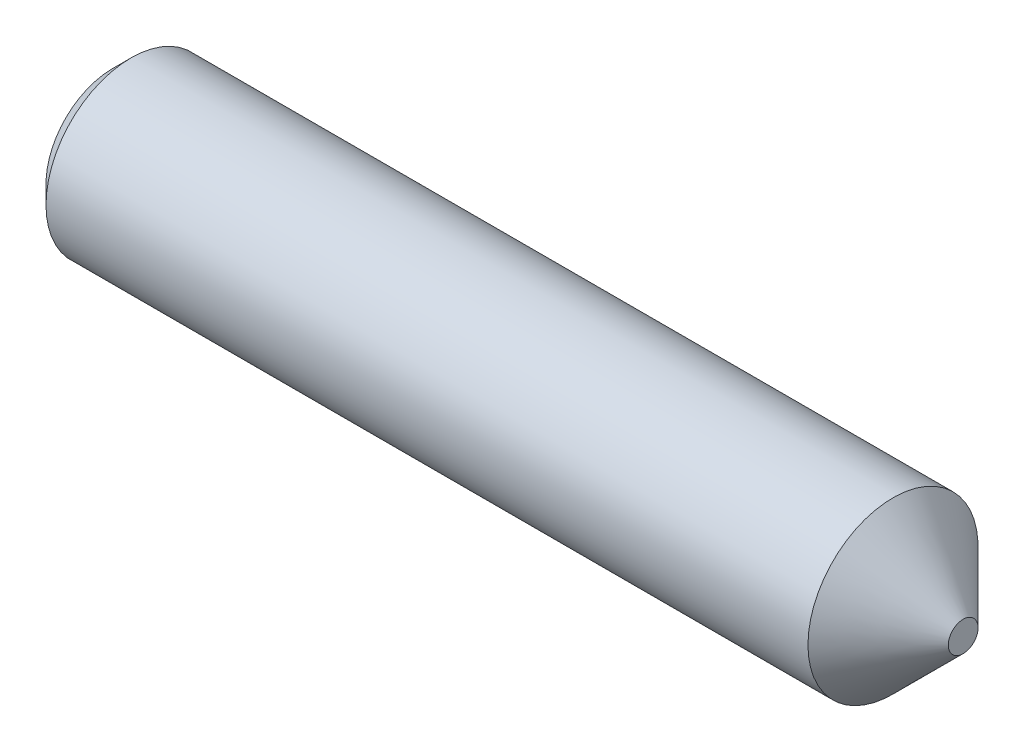
ISO-10303-21;
HEADER;
FILE_DESCRIPTION(('STEP AP214'),'2;1');
FILE_NAME('part.step','',(''),(''),'','','');
FILE_SCHEMA(('AUTOMOTIVE_DESIGN { 1 0 10303 214 1 1 1 1 }'));
ENDSEC;
DATA;
#1=APPLICATION_CONTEXT('core data for automotive mechanical design processes');
#2=APPLICATION_PROTOCOL_DEFINITION('international standard','automotive_design',2000,#1);
#3=PRODUCT_CONTEXT('',#1,'mechanical');
#4=PRODUCT('Part','Part','',(#3));
#5=PRODUCT_RELATED_PRODUCT_CATEGORY('part','',(#4));
#6=PRODUCT_DEFINITION_FORMATION('','',#4);
#7=PRODUCT_DEFINITION_CONTEXT('part definition',#1,'design');
#8=PRODUCT_DEFINITION('design','',#6,#7);
#9=PRODUCT_DEFINITION_SHAPE('','',#8);
#10=(LENGTH_UNIT() NAMED_UNIT(*) SI_UNIT(.MILLI.,.METRE.));
#11=(NAMED_UNIT(*) PLANE_ANGLE_UNIT() SI_UNIT($,.RADIAN.));
#12=(NAMED_UNIT(*) SI_UNIT($,.STERADIAN.) SOLID_ANGLE_UNIT());
#13=UNCERTAINTY_MEASURE_WITH_UNIT(LENGTH_MEASURE(1.E-05),#10,'distance_accuracy_value','');
#14=(GEOMETRIC_REPRESENTATION_CONTEXT(3) GLOBAL_UNCERTAINTY_ASSIGNED_CONTEXT((#13)) GLOBAL_UNIT_ASSIGNED_CONTEXT((#10,
#11,#12)) REPRESENTATION_CONTEXT('',''));
#15=CARTESIAN_POINT('',(0.,0.,0.));
#16=DIRECTION('',(0.,0.,1.));
#17=DIRECTION('',(1.,0.,0.));
#18=AXIS2_PLACEMENT_3D('',#15,#16,#17);
#19=CARTESIAN_POINT('',(0.,-0.999999999999999,0.577350269189626));
#20=DIRECTION('',(0.,-0.5,0.866025403784439));
#21=DIRECTION('',(0.,-0.866025403784439,-0.5));
#22=AXIS2_PLACEMENT_3D('',#19,#20,#21);
#23=PLANE('',#22);
#24=DIRECTION('',(1.,0.,0.));
#25=VECTOR('',#24,1.);
#26=CARTESIAN_POINT('',(0.,-1.,0.577350269189626));
#27=LINE('',#26,#25);
#28=CARTESIAN_POINT('',(3.16666666666667,-1.,0.577350269189626));
#29=VERTEX_POINT('',#28);
#30=CARTESIAN_POINT('',(0.,-0.999999999999999,0.577350269189626));
#31=VERTEX_POINT('',#30);
#32=EDGE_CURVE('E82',#29,#31,#27,.F.);
#33=ORIENTED_EDGE('',*,*,#32,.T.);
#34=DIRECTION('',(0.,-0.866025403784439,-0.5));
#35=VECTOR('',#34,1.);
#36=CARTESIAN_POINT('',(0.,-0.999999999999999,0.577350269189626));
#37=LINE('',#36,#35);
#38=CARTESIAN_POINT('',(0.,0.,1.15470053837925));
#39=VERTEX_POINT('',#38);
#40=EDGE_CURVE('E71',#39,#31,#37,.T.);
#41=ORIENTED_EDGE('',*,*,#40,.F.);
#42=DIRECTION('',(1.,0.,0.));
#43=VECTOR('',#42,1.);
#44=CARTESIAN_POINT('',(0.,0.,1.15470053837925));
#45=LINE('',#44,#43);
#46=CARTESIAN_POINT('',(3.16666666666667,0.,1.15470053837925));
#47=VERTEX_POINT('',#46);
#48=EDGE_CURVE('E146',#39,#47,#45,.T.);
#49=ORIENTED_EDGE('',*,*,#48,.T.);
#50=DIRECTION('',(0.,-0.866025403784439,-0.5));
#51=VECTOR('',#50,1.);
#52=CARTESIAN_POINT('',(3.16666666666667,-0.999999999999999,0.577350269189626));
#53=LINE('',#52,#51);
#54=EDGE_CURVE('E67',#29,#47,#53,.F.);
#55=ORIENTED_EDGE('',*,*,#54,.F.);
#56=EDGE_LOOP('',(#33,#41,#49,#55));
#57=FACE_BOUND('',#56,.T.);
#58=ADVANCED_FACE('F16',(#57),#23,.F.);
#59=CARTESIAN_POINT('',(0.,-1.,-0.577350269189626));
#60=DIRECTION('',(0.,-1.,0.));
#61=DIRECTION('',(0.,0.,-1.));
#62=AXIS2_PLACEMENT_3D('',#59,#60,#61);
#63=PLANE('',#62);
#64=DIRECTION('',(1.,0.,0.));
#65=VECTOR('',#64,1.);
#66=CARTESIAN_POINT('',(0.,-0.999999999999999,-0.577350269189624));
#67=LINE('',#66,#65);
#68=CARTESIAN_POINT('',(3.16666666666667,-1.,-0.577350269189626));
#69=VERTEX_POINT('',#68);
#70=CARTESIAN_POINT('',(0.,-1.,-0.577350269189626));
#71=VERTEX_POINT('',#70);
#72=EDGE_CURVE('E88',#69,#71,#67,.F.);
#73=ORIENTED_EDGE('',*,*,#72,.T.);
#74=DIRECTION('',(0.,0.,-1.));
#75=VECTOR('',#74,1.);
#76=CARTESIAN_POINT('',(0.,-1.,-0.577350269189626));
#77=LINE('',#76,#75);
#78=EDGE_CURVE('E74',#31,#71,#77,.T.);
#79=ORIENTED_EDGE('',*,*,#78,.F.);
#80=ORIENTED_EDGE('',*,*,#32,.F.);
#81=DIRECTION('',(0.,0.,-1.));
#82=VECTOR('',#81,1.);
#83=CARTESIAN_POINT('',(3.16666666666667,-1.,-0.577350269189626));
#84=LINE('',#83,#82);
#85=EDGE_CURVE('E90',#69,#29,#84,.F.);
#86=ORIENTED_EDGE('',*,*,#85,.F.);
#87=EDGE_LOOP('',(#73,#79,#80,#86));
#88=FACE_BOUND('',#87,.T.);
#89=ADVANCED_FACE('F86',(#88),#63,.F.);
#90=CARTESIAN_POINT('',(0.,0.,1.15470053837925));
#91=DIRECTION('',(0.,0.5,0.866025403784439));
#92=DIRECTION('',(0.,-0.866025403784439,0.5));
#93=AXIS2_PLACEMENT_3D('',#90,#91,#92);
#94=PLANE('',#93);
#95=ORIENTED_EDGE('',*,*,#48,.F.);
#96=DIRECTION('',(0.,-0.866025403784439,0.5));
#97=VECTOR('',#96,1.);
#98=CARTESIAN_POINT('',(0.,0.,1.15470053837925));
#99=LINE('',#98,#97);
#100=CARTESIAN_POINT('',(0.,1.,0.577350269189625));
#101=VERTEX_POINT('',#100);
#102=EDGE_CURVE('E77',#101,#39,#99,.T.);
#103=ORIENTED_EDGE('',*,*,#102,.F.);
#104=DIRECTION('',(1.,0.,0.));
#105=VECTOR('',#104,1.);
#106=CARTESIAN_POINT('',(0.,1.,0.577350269189626));
#107=LINE('',#106,#105);
#108=CARTESIAN_POINT('',(3.16666666666667,1.,0.577350269189626));
#109=VERTEX_POINT('',#108);
#110=EDGE_CURVE('E132',#101,#109,#107,.T.);
#111=ORIENTED_EDGE('',*,*,#110,.T.);
#112=DIRECTION('',(0.,-0.866025403784439,0.5));
#113=VECTOR('',#112,1.);
#114=CARTESIAN_POINT('',(3.16666666666667,0.,1.15470053837925));
#115=LINE('',#114,#113);
#116=EDGE_CURVE('E143',#47,#109,#115,.F.);
#117=ORIENTED_EDGE('',*,*,#116,.F.);
#118=EDGE_LOOP('',(#95,#103,#111,#117));
#119=FACE_BOUND('',#118,.T.);
#120=ADVANCED_FACE('F153',(#119),#94,.F.);
#121=CARTESIAN_POINT('',(0.,0.,-1.15470053837925));
#122=DIRECTION('',(0.,-0.5,-0.866025403784438));
#123=DIRECTION('',(0.,0.866025403784438,-0.5));
#124=AXIS2_PLACEMENT_3D('',#121,#122,#123);
#125=PLANE('',#124);
#126=DIRECTION('',(1.,0.,0.));
#127=VECTOR('',#126,1.);
#128=CARTESIAN_POINT('',(0.,0.,-1.15470053837925));
#129=LINE('',#128,#127);
#130=CARTESIAN_POINT('',(3.16666666666667,0.,-1.15470053837925));
#131=VERTEX_POINT('',#130);
#132=CARTESIAN_POINT('',(0.,0.,-1.15470053837925));
#133=VERTEX_POINT('',#132);
#134=EDGE_CURVE('E122',#131,#133,#129,.F.);
#135=ORIENTED_EDGE('',*,*,#134,.T.);
#136=DIRECTION('',(0.,0.866025403784438,-0.5));
#137=VECTOR('',#136,1.);
#138=CARTESIAN_POINT('',(0.,0.,-1.15470053837925));
#139=LINE('',#138,#137);
#140=EDGE_CURVE('E35',#71,#133,#139,.T.);
#141=ORIENTED_EDGE('',*,*,#140,.F.);
#142=ORIENTED_EDGE('',*,*,#72,.F.);
#143=DIRECTION('',(0.,0.866025403784439,-0.499999999999999));
#144=VECTOR('',#143,1.);
#145=CARTESIAN_POINT('',(3.16666666666667,-1.,-0.577350269189626));
#146=LINE('',#145,#144);
#147=EDGE_CURVE('E129',#69,#131,#146,.T.);
#148=ORIENTED_EDGE('',*,*,#147,.T.);
#149=EDGE_LOOP('',(#135,#141,#142,#148));
#150=FACE_BOUND('',#149,.T.);
#151=ADVANCED_FACE('F161',(#150),#125,.F.);
#152=CARTESIAN_POINT('',(0.,1.,0.));
#153=DIRECTION('',(0.,1.,0.));
#154=DIRECTION('',(0.,0.,1.));
#155=AXIS2_PLACEMENT_3D('',#152,#153,#154);
#156=PLANE('',#155);
#157=ORIENTED_EDGE('',*,*,#110,.F.);
#158=DIRECTION('',(0.,0.,1.));
#159=VECTOR('',#158,1.);
#160=CARTESIAN_POINT('',(0.,1.,0.));
#161=LINE('',#160,#159);
#162=CARTESIAN_POINT('',(0.,1.,-0.577350269189627));
#163=VERTEX_POINT('',#162);
#164=EDGE_CURVE('E136',#163,#101,#161,.T.);
#165=ORIENTED_EDGE('',*,*,#164,.F.);
#166=DIRECTION('',(1.,0.,0.));
#167=VECTOR('',#166,1.);
#168=CARTESIAN_POINT('',(0.,1.,-0.577350269189627));
#169=LINE('',#168,#167);
#170=CARTESIAN_POINT('',(3.16666666666667,1.,-0.577350269189627));
#171=VERTEX_POINT('',#170);
#172=EDGE_CURVE('E117',#163,#171,#169,.T.);
#173=ORIENTED_EDGE('',*,*,#172,.T.);
#174=DIRECTION('',(0.,0.,1.));
#175=VECTOR('',#174,1.);
#176=CARTESIAN_POINT('',(3.16666666666667,0.999999999999999,0.));
#177=LINE('',#176,#175);
#178=EDGE_CURVE('E125',#171,#109,#177,.T.);
#179=ORIENTED_EDGE('',*,*,#178,.T.);
#180=EDGE_LOOP('',(#157,#165,#173,#179));
#181=FACE_BOUND('',#180,.T.);
#182=ADVANCED_FACE('F167',(#181),#156,.F.);
#183=CARTESIAN_POINT('',(3.16666666666667,0.,0.));
#184=DIRECTION('',(1.,0.,0.));
#185=DIRECTION('',(0.,1.,0.));
#186=AXIS2_PLACEMENT_3D('',#183,#184,#185);
#187=PLANE('',#186);
#188=DIRECTION('',(0.,0.866025403784439,0.5));
#189=VECTOR('',#188,1.);
#190=CARTESIAN_POINT('',(3.16666666666667,1.,-0.577350269189627));
#191=LINE('',#190,#189);
#192=EDGE_CURVE('E112',#171,#131,#191,.F.);
#193=ORIENTED_EDGE('',*,*,#192,.T.);
#194=ORIENTED_EDGE('',*,*,#147,.F.);
#195=ORIENTED_EDGE('',*,*,#85,.T.);
#196=ORIENTED_EDGE('',*,*,#54,.T.);
#197=ORIENTED_EDGE('',*,*,#116,.T.);
#198=ORIENTED_EDGE('',*,*,#178,.F.);
#199=EDGE_LOOP('',(#193,#194,#195,#196,#197,#198));
#200=FACE_BOUND('',#199,.T.);
#201=ADVANCED_FACE('F157',(#200),#187,.F.);
#202=CARTESIAN_POINT('',(0.,1.,-0.577350269189627));
#203=DIRECTION('',(0.,0.5,-0.866025403784439));
#204=DIRECTION('',(0.,0.866025403784439,0.5));
#205=AXIS2_PLACEMENT_3D('',#202,#203,#204);
#206=PLANE('',#205);
#207=ORIENTED_EDGE('',*,*,#172,.F.);
#208=DIRECTION('',(0.,0.86602540378444,0.499999999999998));
#209=VECTOR('',#208,1.);
#210=CARTESIAN_POINT('',(0.,0.,-1.15470053837925));
#211=LINE('',#210,#209);
#212=EDGE_CURVE('E108',#133,#163,#211,.T.);
#213=ORIENTED_EDGE('',*,*,#212,.F.);
#214=ORIENTED_EDGE('',*,*,#134,.F.);
#215=ORIENTED_EDGE('',*,*,#192,.F.);
#216=EDGE_LOOP('',(#207,#213,#214,#215));
#217=FACE_BOUND('',#216,.T.);
#218=ADVANCED_FACE('F165',(#217),#206,.F.);
#219=CARTESIAN_POINT('',(0.,0.,-1.));
#220=DIRECTION('',(-1.,0.,0.));
#221=DIRECTION('',(0.,0.,1.));
#222=AXIS2_PLACEMENT_3D('',#219,#220,#221);
#223=PLANE('',#222);
#224=CARTESIAN_POINT('',(5.68430936001563E-11,0.,0.));
#225=DIRECTION('',(1.,0.,0.));
#226=DIRECTION('',(0.,0.,-1.));
#227=AXIS2_PLACEMENT_3D('',#224,#225,#226);
#228=CIRCLE('',#227,1.57050000007075);
#229=CARTESIAN_POINT('',(5.68433915795709E-11,0.,-1.57050000007075));
#230=VERTEX_POINT('',#229);
#231=EDGE_CURVE('E19',#230,#230,#228,.T.);
#232=ORIENTED_EDGE('',*,*,#231,.F.);
#233=EDGE_LOOP('',(#232));
#234=FACE_BOUND('',#233,.T.);
#235=ORIENTED_EDGE('',*,*,#140,.T.);
#236=ORIENTED_EDGE('',*,*,#212,.T.);
#237=ORIENTED_EDGE('',*,*,#164,.T.);
#238=ORIENTED_EDGE('',*,*,#102,.T.);
#239=ORIENTED_EDGE('',*,*,#40,.T.);
#240=ORIENTED_EDGE('',*,*,#78,.T.);
#241=EDGE_LOOP('',(#235,#236,#237,#238,#239,#240));
#242=FACE_BOUND('',#241,.T.);
#243=ADVANCED_FACE('F72',(#234,#242),#223,.T.);
#244=CARTESIAN_POINT('',(20.,0.,-1.));
#245=DIRECTION('',(1.,0.,0.));
#246=DIRECTION('',(0.,0.,-1.));
#247=AXIS2_PLACEMENT_3D('',#244,#245,#246);
#248=PLANE('',#247);
#249=CARTESIAN_POINT('',(19.999999999925,0.,0.));
#250=DIRECTION('',(-1.,0.,0.));
#251=DIRECTION('',(0.,0.,1.));
#252=AXIS2_PLACEMENT_3D('',#249,#250,#251);
#253=CIRCLE('',#252,0.350000000196359);
#254=CARTESIAN_POINT('',(19.999999999925,0.,0.350000000196358));
#255=VERTEX_POINT('',#254);
#256=EDGE_CURVE('E98',#255,#255,#253,.T.);
#257=ORIENTED_EDGE('',*,*,#256,.F.);
#258=EDGE_LOOP('',(#257));
#259=FACE_BOUND('',#258,.T.);
#260=ADVANCED_FACE('F191',(#259),#248,.T.);
#261=CARTESIAN_POINT('',(0.429499999881954,0.,0.));
#262=DIRECTION('',(1.,0.,0.));
#263=DIRECTION('',(0.,0.,-1.));
#264=AXIS2_PLACEMENT_3D('',#261,#262,#263);
#265=CONICAL_SURFACE('',#264,1.99999999989586,0.785398163397448);
#266=ORIENTED_EDGE('',*,*,#231,.T.);
#267=EDGE_LOOP('',(#266));
#268=FACE_BOUND('',#267,.T.);
#269=CARTESIAN_POINT('',(0.429499999999999,0.,0.));
#270=DIRECTION('',(-1.,0.,0.));
#271=DIRECTION('',(0.,0.,1.));
#272=AXIS2_PLACEMENT_3D('',#269,#270,#271);
#273=CIRCLE('',#272,2.);
#274=CARTESIAN_POINT('',(0.429499999999999,0.,2.));
#275=VERTEX_POINT('',#274);
#276=EDGE_CURVE('E26',#275,#275,#273,.F.);
#277=ORIENTED_EDGE('',*,*,#276,.F.);
#278=EDGE_LOOP('',(#277));
#279=FACE_BOUND('',#278,.T.);
#280=ADVANCED_FACE('F185',(#268,#279),#265,.T.);
#281=CARTESIAN_POINT('',(18.3500000001118,0.,0.));
#282=DIRECTION('',(-1.,0.,0.));
#283=DIRECTION('',(0.,0.,1.));
#284=AXIS2_PLACEMENT_3D('',#281,#282,#283);
#285=CONICAL_SURFACE('',#284,1.99999999995271,0.785398163380223);
#286=CARTESIAN_POINT('',(18.35,0.,0.));
#287=DIRECTION('',(-1.,0.,0.));
#288=DIRECTION('',(0.,0.,1.));
#289=AXIS2_PLACEMENT_3D('',#286,#287,#288);
#290=CIRCLE('',#289,2.);
#291=CARTESIAN_POINT('',(18.35,0.,2.00000000006448));
#292=VERTEX_POINT('',#291);
#293=EDGE_CURVE('E10',#292,#292,#290,.T.);
#294=CARTESIAN_POINT('',(19.999999999925,0.,0.350000000196358));
#295=CARTESIAN_POINT('',(19.9828124999257,0.,0.367187500194985));
#296=CARTESIAN_POINT('',(19.9656249999265,0.,0.384375000193611));
#297=CARTESIAN_POINT('',(19.9312499999281,0.,0.418750000190864));
#298=CARTESIAN_POINT('',(19.9140624999289,0.,0.43593750018949));
#299=CARTESIAN_POINT('',(19.8796874999304,0.,0.470312500186742));
#300=CARTESIAN_POINT('',(19.8624999999312,0.,0.487500000185369));
#301=CARTESIAN_POINT('',(19.8281249999328,0.,0.521875000182621));
#302=CARTESIAN_POINT('',(19.8109374999336,0.,0.539062500181248));
#303=CARTESIAN_POINT('',(19.7765624999351,0.,0.5734375001785));
#304=CARTESIAN_POINT('',(19.7593749999359,0.,0.590625000177126));
#305=CARTESIAN_POINT('',(19.7249999999375,0.,0.625000000174379));
#306=CARTESIAN_POINT('',(19.7078124999383,0.,0.642187500173006));
#307=CARTESIAN_POINT('',(19.6734374999398,0.,0.676562500170258));
#308=CARTESIAN_POINT('',(19.6562499999406,0.,0.693750000168884));
#309=CARTESIAN_POINT('',(19.6218749999422,0.,0.728125000166137));
#310=CARTESIAN_POINT('',(19.6046874999429,0.,0.745312500164763));
#311=CARTESIAN_POINT('',(19.5703124999445,0.,0.779687500162016));
#312=CARTESIAN_POINT('',(19.5531249999453,0.,0.796875000160642));
#313=CARTESIAN_POINT('',(19.5187499999469,0.,0.831250000157895));
#314=CARTESIAN_POINT('',(19.5015624999476,0.,0.848437500156521));
#315=CARTESIAN_POINT('',(19.4671874999492,0.,0.882812500153773));
#316=CARTESIAN_POINT('',(19.44999999995,0.,0.9000000001524));
#317=CARTESIAN_POINT('',(19.4156249999515,0.,0.934375000149653));
#318=CARTESIAN_POINT('',(19.3984374999523,0.,0.951562500148279));
#319=CARTESIAN_POINT('',(19.3640624999539,0.,0.985937500145531));
#320=CARTESIAN_POINT('',(19.3468749999547,0.,1.00312500014416));
#321=CARTESIAN_POINT('',(19.3124999999562,0.,1.03750000014141));
#322=CARTESIAN_POINT('',(19.295312499957,0.,1.05468750014004));
#323=CARTESIAN_POINT('',(19.2609374999586,0.,1.08906250013729));
#324=CARTESIAN_POINT('',(19.2437499999594,0.,1.10625000013592));
#325=CARTESIAN_POINT('',(19.2093749999609,0.,1.14062500013317));
#326=CARTESIAN_POINT('',(19.1921874999617,0.,1.15781250013179));
#327=CARTESIAN_POINT('',(19.1578124999633,0.,1.19218750012905));
#328=CARTESIAN_POINT('',(19.140624999964,0.,1.20937500012767));
#329=CARTESIAN_POINT('',(19.1062499999656,0.,1.24375000012493));
#330=CARTESIAN_POINT('',(19.0890624999664,0.,1.26093750012355));
#331=CARTESIAN_POINT('',(19.054687499968,0.,1.29531250012081));
#332=CARTESIAN_POINT('',(19.0374999999687,0.,1.31250000011943));
#333=CARTESIAN_POINT('',(19.0031249999703,0.,1.34687500011668));
#334=CARTESIAN_POINT('',(18.9859374999711,0.,1.36406250011531));
#335=CARTESIAN_POINT('',(18.9515624999726,0.,1.39843750011256));
#336=CARTESIAN_POINT('',(18.9343749999734,0.,1.41562500011119));
#337=CARTESIAN_POINT('',(18.899999999975,0.,1.45000000010844));
#338=CARTESIAN_POINT('',(18.8828124999758,0.,1.46718750010707));
#339=CARTESIAN_POINT('',(18.8484374999773,0.,1.50156250010432));
#340=CARTESIAN_POINT('',(18.8312499999781,0.,1.51875000010295));
#341=CARTESIAN_POINT('',(18.7968749999797,0.,1.5531250001002));
#342=CARTESIAN_POINT('',(18.7796874999805,0.,1.57031250009883));
#343=CARTESIAN_POINT('',(18.745312499982,0.,1.60468750009608));
#344=CARTESIAN_POINT('',(18.7281249999828,0.,1.6218750000947));
#345=CARTESIAN_POINT('',(18.6937499999844,0.,1.65625000009196));
#346=CARTESIAN_POINT('',(18.6765624999851,0.,1.67343750009058));
#347=CARTESIAN_POINT('',(18.6421874999867,0.,1.70781250008784));
#348=CARTESIAN_POINT('',(18.6249999999875,0.,1.72500000008646));
#349=CARTESIAN_POINT('',(18.5906249999891,0.,1.75937500008372));
#350=CARTESIAN_POINT('',(18.5734374999898,0.,1.77656250008234));
#351=CARTESIAN_POINT('',(18.5390624999914,0.,1.81093750007959));
#352=CARTESIAN_POINT('',(18.5218749999922,0.,1.82812500007822));
#353=CARTESIAN_POINT('',(18.4874999999937,0.,1.86250000007547));
#354=CARTESIAN_POINT('',(18.4703124999945,0.,1.8796875000741));
#355=CARTESIAN_POINT('',(18.4359374999961,0.,1.91406250007135));
#356=CARTESIAN_POINT('',(18.4187499999969,0.,1.93125000006998));
#357=CARTESIAN_POINT('',(18.3843749999984,0.,1.96562500006723));
#358=CARTESIAN_POINT('',(18.3671874999992,0.,1.98281250006586));
#359=CARTESIAN_POINT('',(18.35,0.,2.00000000006448));
#360=B_SPLINE_CURVE_WITH_KNOTS('',3,(#294,#295,#296,#297,#298,#299,#300,#301,#302,#303,#304,
#305,#306,#307,#308,#309,#310,#311,#312,#313,#314,#315,#316,#317,#318,#319,#320,#321,#322,#323,
#324,#325,#326,#327,#328,#329,#330,#331,#332,#333,#334,#335,#336,#337,#338,#339,#340,#341,#342,
#343,#344,#345,#346,#347,#348,#349,#350,#351,#352,#353,#354,#355,#356,#357,#358,#359),
.UNSPECIFIED.,.F.,.F.,(4,2,2,2,2,2,2,2,2,2,2,2,2,2,2,2,2,2,2,2,2,2,2,2,2,2,2,2,2,2,2,2,4),(0.,
0.0729203868052887,0.14584077361058,0.218761160415871,0.291681547221162,0.364601934026453,
0.437522320831742,0.510442707637033,0.583363094442324,0.656283481247615,0.729203868052906,
0.802124254858195,0.875044641663486,0.947965028468777,1.02088541527407,1.09380580207936,
1.16672618888465,1.23964657568994,1.31256696249523,1.38548734930052,1.45840773610581,
1.5313281229111,1.60424850971639,1.67716889652168,1.75008928332697,1.82300967013227,
1.89593005693756,1.96885044374285,2.04177083054814,2.11469121735343,2.18761160415872,
2.26053199096401,2.3334523777693),.UNSPECIFIED.);
#361=EDGE_CURVE('BSEAM179',#255,#292,#360,.T.);
#362=ORIENTED_EDGE('',*,*,#256,.T.);
#363=ORIENTED_EDGE('',*,*,#293,.F.);
#364=ORIENTED_EDGE('',*,*,#361,.T.);
#365=ORIENTED_EDGE('',*,*,#361,.F.);
#366=EDGE_LOOP('',(#362,#364,#363,#365));
#367=FACE_BOUND('',#366,.T.);
#368=ADVANCED_FACE('F179',(#367),#285,.T.);
#369=CARTESIAN_POINT('',(10.,0.,0.));
#370=DIRECTION('',(-1.,0.,0.));
#371=DIRECTION('',(0.,0.,1.));
#372=AXIS2_PLACEMENT_3D('',#369,#370,#371);
#373=CYLINDRICAL_SURFACE('',#372,2.);
#374=ORIENTED_EDGE('',*,*,#276,.T.);
#375=EDGE_LOOP('',(#374));
#376=FACE_BOUND('',#375,.T.);
#377=ORIENTED_EDGE('',*,*,#293,.T.);
#378=EDGE_LOOP('',(#377));
#379=FACE_BOUND('',#378,.T.);
#380=ADVANCED_FACE('F177',(#376,#379),#373,.T.);
#381=CLOSED_SHELL('',(#58,#89,#120,#151,#182,#201,#218,#243,#260,#280,#368,#380));
#382=MANIFOLD_SOLID_BREP('B1',#381);
#383=ADVANCED_BREP_SHAPE_REPRESENTATION('',(#18,#382),#14);
#384=SHAPE_DEFINITION_REPRESENTATION(#9,#383);
ENDSEC;
END-ISO-10303-21;
